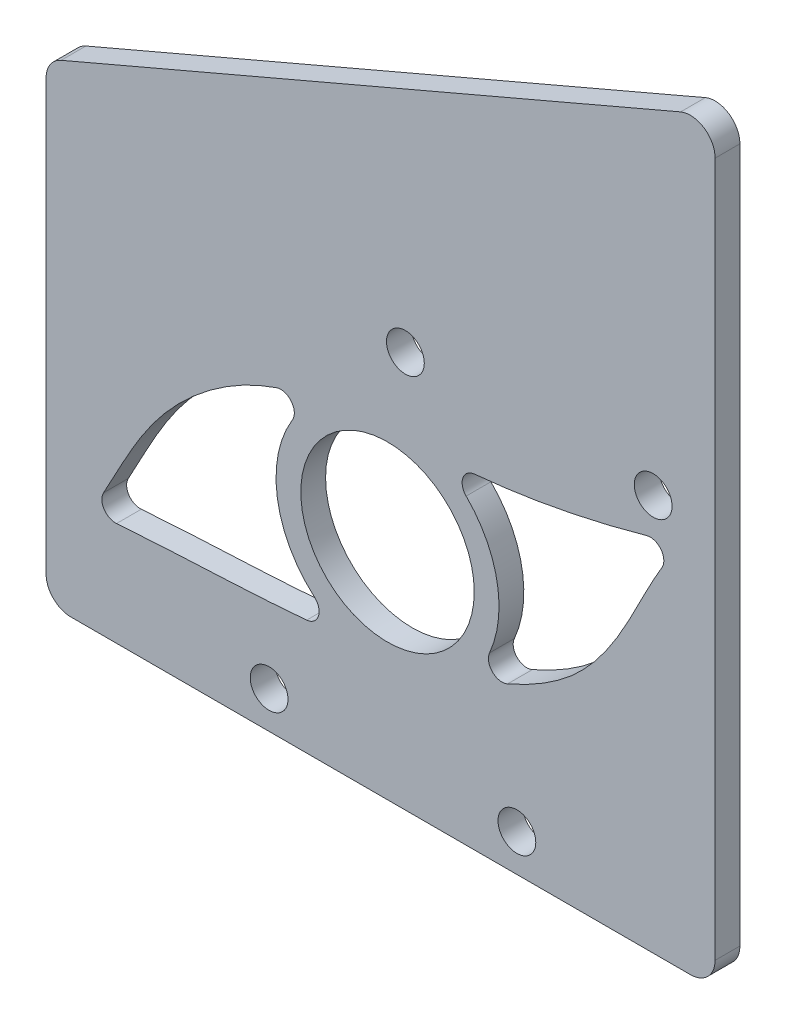
ISO-10303-21;
HEADER;
FILE_DESCRIPTION(('STEP AP214'),'2;1');
FILE_NAME('part.step','',(''),(''),'','','');
FILE_SCHEMA(('AUTOMOTIVE_DESIGN { 1 0 10303 214 1 1 1 1 }'));
ENDSEC;
DATA;
#1=APPLICATION_CONTEXT('core data for automotive mechanical design processes');
#2=APPLICATION_PROTOCOL_DEFINITION('international standard','automotive_design',2000,#1);
#3=PRODUCT_CONTEXT('',#1,'mechanical');
#4=PRODUCT('Part','Part','',(#3));
#5=PRODUCT_RELATED_PRODUCT_CATEGORY('part','',(#4));
#6=PRODUCT_DEFINITION_FORMATION('','',#4);
#7=PRODUCT_DEFINITION_CONTEXT('part definition',#1,'design');
#8=PRODUCT_DEFINITION('design','',#6,#7);
#9=PRODUCT_DEFINITION_SHAPE('','',#8);
#10=(LENGTH_UNIT() NAMED_UNIT(*) SI_UNIT(.MILLI.,.METRE.));
#11=(NAMED_UNIT(*) PLANE_ANGLE_UNIT() SI_UNIT($,.RADIAN.));
#12=(NAMED_UNIT(*) SI_UNIT($,.STERADIAN.) SOLID_ANGLE_UNIT());
#13=UNCERTAINTY_MEASURE_WITH_UNIT(LENGTH_MEASURE(1.E-05),#10,'distance_accuracy_value','');
#14=(GEOMETRIC_REPRESENTATION_CONTEXT(3) GLOBAL_UNCERTAINTY_ASSIGNED_CONTEXT((#13)) GLOBAL_UNIT_ASSIGNED_CONTEXT((#10,
#11,#12)) REPRESENTATION_CONTEXT('',''));
#15=CARTESIAN_POINT('',(0.,0.,0.));
#16=DIRECTION('',(0.,0.,1.));
#17=DIRECTION('',(1.,0.,0.));
#18=AXIS2_PLACEMENT_3D('',#15,#16,#17);
#19=CARTESIAN_POINT('',(24.4834686689324,-6.167126567928,-52.5424006692833));
#20=CARTESIAN_POINT('',(18.8149067201333,-7.97288352978751,-52.5424006692833));
#21=CARTESIAN_POINT('',(9.98146004351233,-9.93232100835814,-52.5424006692833));
#22=CARTESIAN_POINT('',(-1.49904126776518,-10.1027118257672,-52.5424006692833));
#23=CARTESIAN_POINT('',(-10.8339013777596,-11.7565277484964,-52.5424006692833));
#24=CARTESIAN_POINT('',(-18.8414235125109,-18.327485380999,-52.5424006692833));
#25=CARTESIAN_POINT('',(-21.6732340433988,-24.9521936855528,-52.5424006692833));
#26=CARTESIAN_POINT('',(-23.3973415018457,-27.8034822102587,-52.5424006692833));
#27=B_SPLINE_CURVE_WITH_KNOTS('',3,(#19,#20,#21,#22,#23,#24,#25,#26),.UNSPECIFIED.,.F.,.F.,(4,1,
1,1,1,4),(0.,0.320082160262888,0.479359865473657,0.616457885345299,0.821262387023552,1.),.UNSPECIFIED.);
#28=DIRECTION('',(0.,0.,1.));
#29=VECTOR('',#28,1.);
#30=SURFACE_OF_LINEAR_EXTRUSION('',#27,#29);
#31=CARTESIAN_POINT('',(24.4834686689324,-6.167126567928,0.));
#32=CARTESIAN_POINT('',(18.8149067201333,-7.97288352978751,0.));
#33=CARTESIAN_POINT('',(9.98146004351233,-9.93232100835814,0.));
#34=CARTESIAN_POINT('',(-1.49904126776518,-10.1027118257672,0.));
#35=CARTESIAN_POINT('',(-10.8339013777596,-11.7565277484964,0.));
#36=CARTESIAN_POINT('',(-18.8414235125109,-18.327485380999,0.));
#37=CARTESIAN_POINT('',(-21.6732340433988,-24.9521936855528,0.));
#38=CARTESIAN_POINT('',(-23.3973415018457,-27.8034822102587,0.));
#39=B_SPLINE_CURVE_WITH_KNOTS('',3,(#31,#32,#33,#34,#35,#36,#37,#38),.UNSPECIFIED.,.F.,.F.,(4,1,
1,1,1,4),(0.,0.320082160262888,0.479359865473657,0.616457885345299,0.821262387023552,1.),.UNSPECIFIED.);
#40=CARTESIAN_POINT('',(21.4597985438598,-7.07553364279421,0.));
#41=VERTEX_POINT('',#40);
#42=CARTESIAN_POINT('',(7.57735937615618,-9.72232528661631,0.));
#43=VERTEX_POINT('',#42);
#44=EDGE_CURVE('E224',#41,#43,#39,.T.);
#45=ORIENTED_EDGE('',*,*,#44,.F.);
#46=DIRECTION('',(0.,0.,1.));
#47=VECTOR('',#46,1.);
#48=CARTESIAN_POINT('',(21.4597985438598,-7.07553364279422,0.));
#49=LINE('',#48,#47);
#50=CARTESIAN_POINT('',(21.4597985438598,-7.07553364279421,2.));
#51=VERTEX_POINT('',#50);
#52=EDGE_CURVE('E346',#41,#51,#49,.T.);
#53=ORIENTED_EDGE('',*,*,#52,.T.);
#54=CARTESIAN_POINT('',(24.4834686689324,-6.167126567928,2.));
#55=CARTESIAN_POINT('',(18.8149067201333,-7.97288352978751,2.));
#56=CARTESIAN_POINT('',(9.98146004351233,-9.93232100835814,2.));
#57=CARTESIAN_POINT('',(-1.49904126776518,-10.1027118257672,2.));
#58=CARTESIAN_POINT('',(-10.8339013777596,-11.7565277484964,2.));
#59=CARTESIAN_POINT('',(-18.8414235125109,-18.327485380999,2.));
#60=CARTESIAN_POINT('',(-21.6732340433988,-24.9521936855528,2.));
#61=CARTESIAN_POINT('',(-23.3973415018457,-27.8034822102587,2.));
#62=B_SPLINE_CURVE_WITH_KNOTS('',3,(#54,#55,#56,#57,#58,#59,#60,#61),.UNSPECIFIED.,.F.,.F.,(4,1,
1,1,1,4),(0.,0.320082160262888,0.479359865473657,0.616457885345299,0.821262387023552,1.),.UNSPECIFIED.);
#63=CARTESIAN_POINT('',(7.57735937615618,-9.72232528661631,2.));
#64=VERTEX_POINT('',#63);
#65=EDGE_CURVE('E206',#51,#64,#62,.T.);
#66=ORIENTED_EDGE('',*,*,#65,.T.);
#67=DIRECTION('',(0.,0.,1.));
#68=VECTOR('',#67,1.);
#69=CARTESIAN_POINT('',(7.57735937615618,-9.72232528661631,2.));
#70=LINE('',#69,#68);
#71=EDGE_CURVE('E349',#64,#43,#70,.F.);
#72=ORIENTED_EDGE('',*,*,#71,.T.);
#73=EDGE_LOOP('',(#45,#53,#66,#72));
#74=FACE_BOUND('',#73,.T.);
#75=ADVANCED_FACE('F35',(#74),#30,.F.);
#76=CARTESIAN_POINT('',(-23.3973415018457,-27.8034822102587,-52.5424006692833));
#77=CARTESIAN_POINT('',(-13.158468218241,-26.8216783748354,-52.5424006692833));
#78=CARTESIAN_POINT('',(0.767412540322951,-27.6833637015495,-52.5424006692833));
#79=CARTESIAN_POINT('',(15.1765083389906,-20.9102095983924,-52.5424006692833));
#80=CARTESIAN_POINT('',(20.3554938314466,-13.9729246686332,-52.5424006692833));
#81=CARTESIAN_POINT('',(22.1635448027454,-8.91937274897324,-52.5424006692833));
#82=CARTESIAN_POINT('',(24.4834686689324,-6.167126567928,-52.5424006692833));
#83=B_SPLINE_CURVE_WITH_KNOTS('',3,(#76,#77,#78,#79,#80,#81,#82),.UNSPECIFIED.,.F.,.F.,(4,1,1,1,
4),(0.,0.548813093772801,0.719371646716377,0.811056969869215,1.),.UNSPECIFIED.);
#84=DIRECTION('',(0.,0.,1.));
#85=VECTOR('',#84,1.);
#86=SURFACE_OF_LINEAR_EXTRUSION('',#83,#85);
#87=CARTESIAN_POINT('',(-23.3973415018457,-27.8034822102587,2.));
#88=CARTESIAN_POINT('',(-13.158468218241,-26.8216783748354,2.));
#89=CARTESIAN_POINT('',(0.767412540322951,-27.6833637015495,2.));
#90=CARTESIAN_POINT('',(15.1765083389906,-20.9102095983924,2.));
#91=CARTESIAN_POINT('',(20.3554938314466,-13.9729246686332,2.));
#92=CARTESIAN_POINT('',(22.1635448027454,-8.91937274897324,2.));
#93=CARTESIAN_POINT('',(24.4834686689324,-6.167126567928,2.));
#94=B_SPLINE_CURVE_WITH_KNOTS('',3,(#87,#88,#89,#90,#91,#92,#93),.UNSPECIFIED.,.F.,.F.,(4,1,1,1,
4),(0.,0.548813093772801,0.719371646716377,0.811056969869215,1.),.UNSPECIFIED.);
#95=CARTESIAN_POINT('',(-21.316130722331,-27.6251175411089,2.));
#96=VERTEX_POINT('',#95);
#97=CARTESIAN_POINT('',(-5.96758994390592,-26.7017172617705,2.));
#98=VERTEX_POINT('',#97);
#99=EDGE_CURVE('E191',#96,#98,#94,.T.);
#100=ORIENTED_EDGE('',*,*,#99,.T.);
#101=DIRECTION('',(0.,0.,1.));
#102=VECTOR('',#101,1.);
#103=CARTESIAN_POINT('',(-5.96758994390591,-26.7017172617705,2.));
#104=LINE('',#103,#102);
#105=CARTESIAN_POINT('',(-5.96758994390592,-26.7017172617705,0.));
#106=VERTEX_POINT('',#105);
#107=EDGE_CURVE('E195',#98,#106,#104,.F.);
#108=ORIENTED_EDGE('',*,*,#107,.T.);
#109=CARTESIAN_POINT('',(-23.3973415018457,-27.8034822102587,0.));
#110=CARTESIAN_POINT('',(-13.158468218241,-26.8216783748354,0.));
#111=CARTESIAN_POINT('',(0.767412540322951,-27.6833637015495,0.));
#112=CARTESIAN_POINT('',(15.1765083389906,-20.9102095983924,0.));
#113=CARTESIAN_POINT('',(20.3554938314466,-13.9729246686332,0.));
#114=CARTESIAN_POINT('',(22.1635448027454,-8.91937274897324,0.));
#115=CARTESIAN_POINT('',(24.4834686689324,-6.167126567928,0.));
#116=B_SPLINE_CURVE_WITH_KNOTS('',3,(#109,#110,#111,#112,#113,#114,#115),.UNSPECIFIED.,.F.,.F.,
(4,1,1,1,4),(0.,0.548813093772801,0.719371646716377,0.811056969869215,1.),.UNSPECIFIED.);
#117=CARTESIAN_POINT('',(-21.316130722331,-27.6251175411089,0.));
#118=VERTEX_POINT('',#117);
#119=EDGE_CURVE('E194',#118,#106,#116,.T.);
#120=ORIENTED_EDGE('',*,*,#119,.F.);
#121=DIRECTION('',(0.,0.,1.));
#122=VECTOR('',#121,1.);
#123=CARTESIAN_POINT('',(-21.316130722331,-27.6251175411089,0.));
#124=LINE('',#123,#122);
#125=EDGE_CURVE('E177',#118,#96,#124,.T.);
#126=ORIENTED_EDGE('',*,*,#125,.T.);
#127=EDGE_LOOP('',(#100,#108,#120,#126));
#128=FACE_BOUND('',#127,.T.);
#129=ADVANCED_FACE('F189',(#128),#86,.F.);
#130=CARTESIAN_POINT('',(27.,-36.,2.));
#131=DIRECTION('',(-1.,0.,0.));
#132=DIRECTION('',(0.,0.,1.));
#133=AXIS2_PLACEMENT_3D('',#130,#131,#132);
#134=PLANE('',#133);
#135=DIRECTION('',(0.,1.,0.));
#136=VECTOR('',#135,1.);
#137=CARTESIAN_POINT('',(27.,-36.,0.));
#138=LINE('',#137,#136);
#139=CARTESIAN_POINT('',(27.,-34.,0.));
#140=VERTEX_POINT('',#139);
#141=CARTESIAN_POINT('',(27.,22.0742005455741,0.));
#142=VERTEX_POINT('',#141);
#143=EDGE_CURVE('E432',#140,#142,#138,.T.);
#144=ORIENTED_EDGE('',*,*,#143,.T.);
#145=DIRECTION('',(0.,0.,1.));
#146=VECTOR('',#145,1.);
#147=CARTESIAN_POINT('',(27.,22.0742005455741,2.));
#148=LINE('',#147,#146);
#149=CARTESIAN_POINT('',(27.,22.0742005455741,2.));
#150=VERTEX_POINT('',#149);
#151=EDGE_CURVE('E415',#142,#150,#148,.T.);
#152=ORIENTED_EDGE('',*,*,#151,.T.);
#153=DIRECTION('',(0.,1.,0.));
#154=VECTOR('',#153,1.);
#155=CARTESIAN_POINT('',(27.,-36.,2.));
#156=LINE('',#155,#154);
#157=CARTESIAN_POINT('',(27.,-34.,2.));
#158=VERTEX_POINT('',#157);
#159=EDGE_CURVE('E434',#158,#150,#156,.T.);
#160=ORIENTED_EDGE('',*,*,#159,.F.);
#161=DIRECTION('',(0.,0.,-1.));
#162=VECTOR('',#161,1.);
#163=CARTESIAN_POINT('',(27.,-34.,2.));
#164=LINE('',#163,#162);
#165=EDGE_CURVE('E412',#158,#140,#164,.T.);
#166=ORIENTED_EDGE('',*,*,#165,.T.);
#167=EDGE_LOOP('',(#144,#152,#160,#166));
#168=FACE_BOUND('',#167,.T.);
#169=ADVANCED_FACE('F294',(#168),#134,.F.);
#170=CARTESIAN_POINT('',(-27.,-36.,2.));
#171=DIRECTION('',(1.,0.,0.));
#172=DIRECTION('',(0.,0.,-1.));
#173=AXIS2_PLACEMENT_3D('',#170,#171,#172);
#174=PLANE('',#173);
#175=DIRECTION('',(0.,-1.,0.));
#176=VECTOR('',#175,1.);
#177=CARTESIAN_POINT('',(-27.,-36.,2.));
#178=LINE('',#177,#176);
#179=CARTESIAN_POINT('',(-27.,0.68036519451798,2.));
#180=VERTEX_POINT('',#179);
#181=CARTESIAN_POINT('',(-27.,-34.,2.));
#182=VERTEX_POINT('',#181);
#183=EDGE_CURVE('E428',#180,#182,#178,.T.);
#184=ORIENTED_EDGE('',*,*,#183,.F.);
#185=DIRECTION('',(0.,0.,1.));
#186=VECTOR('',#185,1.);
#187=CARTESIAN_POINT('',(-27.,0.68036519451798,2.));
#188=LINE('',#187,#186);
#189=CARTESIAN_POINT('',(-27.,0.68036519451798,0.));
#190=VERTEX_POINT('',#189);
#191=EDGE_CURVE('E404',#180,#190,#188,.F.);
#192=ORIENTED_EDGE('',*,*,#191,.T.);
#193=DIRECTION('',(0.,-1.,0.));
#194=VECTOR('',#193,1.);
#195=CARTESIAN_POINT('',(-27.,-36.,0.));
#196=LINE('',#195,#194);
#197=CARTESIAN_POINT('',(-27.,-34.,0.));
#198=VERTEX_POINT('',#197);
#199=EDGE_CURVE('E439',#190,#198,#196,.T.);
#200=ORIENTED_EDGE('',*,*,#199,.T.);
#201=DIRECTION('',(0.,0.,-1.));
#202=VECTOR('',#201,1.);
#203=CARTESIAN_POINT('',(-27.,-34.,2.));
#204=LINE('',#203,#202);
#205=EDGE_CURVE('E402',#198,#182,#204,.F.);
#206=ORIENTED_EDGE('',*,*,#205,.T.);
#207=EDGE_LOOP('',(#184,#192,#200,#206));
#208=FACE_BOUND('',#207,.T.);
#209=ADVANCED_FACE('F290',(#208),#174,.F.);
#210=CARTESIAN_POINT('',(-27.,-36.,2.));
#211=DIRECTION('',(0.,1.,0.));
#212=DIRECTION('',(0.,0.,1.));
#213=AXIS2_PLACEMENT_3D('',#210,#211,#212);
#214=PLANE('',#213);
#215=DIRECTION('',(1.,0.,0.));
#216=VECTOR('',#215,1.);
#217=CARTESIAN_POINT('',(-27.,-36.,2.));
#218=LINE('',#217,#216);
#219=CARTESIAN_POINT('',(-25.,-36.,2.));
#220=VERTEX_POINT('',#219);
#221=CARTESIAN_POINT('',(25.,-36.,2.));
#222=VERTEX_POINT('',#221);
#223=EDGE_CURVE('E196',#220,#222,#218,.T.);
#224=ORIENTED_EDGE('',*,*,#223,.F.);
#225=DIRECTION('',(0.,0.,-1.));
#226=VECTOR('',#225,1.);
#227=CARTESIAN_POINT('',(-25.,-36.,2.));
#228=LINE('',#227,#226);
#229=CARTESIAN_POINT('',(-25.,-36.,0.));
#230=VERTEX_POINT('',#229);
#231=EDGE_CURVE('E11',#220,#230,#228,.T.);
#232=ORIENTED_EDGE('',*,*,#231,.T.);
#233=DIRECTION('',(1.,0.,0.));
#234=VECTOR('',#233,1.);
#235=CARTESIAN_POINT('',(-27.,-36.,0.));
#236=LINE('',#235,#234);
#237=CARTESIAN_POINT('',(25.,-36.,0.));
#238=VERTEX_POINT('',#237);
#239=EDGE_CURVE('E420',#230,#238,#236,.T.);
#240=ORIENTED_EDGE('',*,*,#239,.T.);
#241=DIRECTION('',(0.,0.,-1.));
#242=VECTOR('',#241,1.);
#243=CARTESIAN_POINT('',(25.,-36.,2.));
#244=LINE('',#243,#242);
#245=EDGE_CURVE('E43',#238,#222,#244,.F.);
#246=ORIENTED_EDGE('',*,*,#245,.T.);
#247=EDGE_LOOP('',(#224,#232,#240,#246));
#248=FACE_BOUND('',#247,.T.);
#249=ADVANCED_FACE('F283',(#248),#214,.F.);
#250=CARTESIAN_POINT('',(0.,0.,2.));
#251=DIRECTION('',(0.,0.,-1.));
#252=DIRECTION('',(-1.,0.,0.));
#253=AXIS2_PLACEMENT_3D('',#250,#251,#252);
#254=PLANE('',#253);
#255=CARTESIAN_POINT('',(10.2432747561689,-23.0587249000968,2.));
#256=VERTEX_POINT('',#255);
#257=CARTESIAN_POINT('',(22.7017523320478,-8.70002765039837,2.));
#258=VERTEX_POINT('',#257);
#259=EDGE_CURVE('E204',#256,#258,#94,.T.);
#260=ORIENTED_EDGE('',*,*,#259,.F.);
#261=CARTESIAN_POINT('',(9.80157844743188,-22.0513002771854,2.));
#262=DIRECTION('',(0.,0.,-1.));
#263=DIRECTION('',(-1.,0.,0.));
#264=AXIS2_PLACEMENT_3D('',#261,#262,#263);
#265=CIRCLE('',#264,1.1);
#266=CARTESIAN_POINT('',(8.79486911469692,-21.6079761075484,2.));
#267=VERTEX_POINT('',#266);
#268=EDGE_CURVE('E377',#256,#267,#265,.T.);
#269=ORIENTED_EDGE('',*,*,#268,.T.);
#270=CARTESIAN_POINT('',(0.558156392319958,-17.980778355973,2.));
#271=DIRECTION('',(0.,0.,1.));
#272=DIRECTION('',(1.,0.,0.));
#273=AXIS2_PLACEMENT_3D('',#270,#271,#272);
#274=CIRCLE('',#273,9.);
#275=CARTESIAN_POINT('',(6.90304701555683,-11.597803894238,2.));
#276=VERTEX_POINT('',#275);
#277=EDGE_CURVE('E473',#267,#276,#274,.T.);
#278=ORIENTED_EDGE('',*,*,#277,.T.);
#279=CARTESIAN_POINT('',(7.67853364728578,-10.8176625711371,2.));
#280=DIRECTION('',(0.,0.,-1.));
#281=DIRECTION('',(-1.,0.,0.));
#282=AXIS2_PLACEMENT_3D('',#279,#280,#281);
#283=CIRCLE('',#282,1.1);
#284=EDGE_CURVE('E184',#276,#64,#283,.T.);
#285=ORIENTED_EDGE('',*,*,#284,.T.);
#286=ORIENTED_EDGE('',*,*,#65,.F.);
#287=CARTESIAN_POINT('',(21.7584261783473,-8.13422223530874,2.));
#288=DIRECTION('',(0.,0.,-1.));
#289=DIRECTION('',(-1.,0.,0.));
#290=AXIS2_PLACEMENT_3D('',#287,#288,#289);
#291=CIRCLE('',#290,1.1);
#292=EDGE_CURVE('E353',#51,#258,#291,.T.);
#293=ORIENTED_EDGE('',*,*,#292,.T.);
#294=EDGE_LOOP('',(#260,#269,#278,#285,#286,#293));
#295=FACE_BOUND('',#294,.T.);
#296=CARTESIAN_POINT('',(-8.42250091878612,-11.6817790482168,2.));
#297=VERTEX_POINT('',#296);
#298=CARTESIAN_POINT('',(-22.3644937882554,-25.9995137748564,2.));
#299=VERTEX_POINT('',#298);
#300=EDGE_CURVE('E203',#297,#299,#62,.T.);
#301=ORIENTED_EDGE('',*,*,#300,.F.);
#302=CARTESIAN_POINT('',(-8.06478714875739,-12.7219909779369,2.));
#303=DIRECTION('',(0.,0.,-1.));
#304=DIRECTION('',(-1.,0.,0.));
#305=AXIS2_PLACEMENT_3D('',#302,#303,#304);
#306=CIRCLE('',#305,1.1);
#307=CARTESIAN_POINT('',(-7.12565468388758,-13.2947301973269,2.));
#308=VERTEX_POINT('',#307);
#309=EDGE_CURVE('E385',#297,#308,#306,.T.);
#310=ORIENTED_EDGE('',*,*,#309,.T.);
#311=CARTESIAN_POINT('',(-5.34361746633097,-24.7755605689173,2.));
#312=VERTEX_POINT('',#311);
#313=EDGE_CURVE('E469',#308,#312,#274,.T.);
#314=ORIENTED_EDGE('',*,*,#313,.T.);
#315=CARTESIAN_POINT('',(-6.0649453823883,-25.6060339504994,2.));
#316=DIRECTION('',(0.,0.,-1.));
#317=DIRECTION('',(-1.,0.,0.));
#318=AXIS2_PLACEMENT_3D('',#315,#316,#317);
#319=CIRCLE('',#318,1.1);
#320=EDGE_CURVE('E202',#312,#98,#319,.T.);
#321=ORIENTED_EDGE('',*,*,#320,.T.);
#322=ORIENTED_EDGE('',*,*,#99,.F.);
#323=CARTESIAN_POINT('',(-21.3999371076979,-26.528314692019,2.));
#324=DIRECTION('',(0.,0.,-1.));
#325=DIRECTION('',(-1.,0.,0.));
#326=AXIS2_PLACEMENT_3D('',#323,#324,#325);
#327=CIRCLE('',#326,1.1);
#328=EDGE_CURVE('E173',#96,#299,#327,.T.);
#329=ORIENTED_EDGE('',*,*,#328,.T.);
#330=EDGE_LOOP('',(#301,#310,#314,#321,#322,#329));
#331=FACE_BOUND('',#330,.T.);
#332=CARTESIAN_POINT('',(-8.99999999999999,-33.,2.));
#333=DIRECTION('',(0.,0.,1.));
#334=DIRECTION('',(1.,0.,0.));
#335=AXIS2_PLACEMENT_3D('',#332,#333,#334);
#336=CIRCLE('',#335,1.525);
#337=CARTESIAN_POINT('',(-7.47499999999999,-33.,2.));
#338=VERTEX_POINT('',#337);
#339=EDGE_CURVE('E453',#338,#338,#336,.T.);
#340=ORIENTED_EDGE('',*,*,#339,.F.);
#341=EDGE_LOOP('',(#340));
#342=FACE_BOUND('',#341,.T.);
#343=CARTESIAN_POINT('',(11.,-33.,2.));
#344=DIRECTION('',(0.,0.,1.));
#345=DIRECTION('',(1.,0.,0.));
#346=AXIS2_PLACEMENT_3D('',#343,#344,#345);
#347=CIRCLE('',#346,1.525);
#348=CARTESIAN_POINT('',(12.525,-33.,2.));
#349=VERTEX_POINT('',#348);
#350=EDGE_CURVE('E484',#349,#349,#347,.T.);
#351=ORIENTED_EDGE('',*,*,#350,.F.);
#352=EDGE_LOOP('',(#351));
#353=FACE_BOUND('',#352,.T.);
#354=CARTESIAN_POINT('',(1.99999999999999,-4.00000000000002,2.));
#355=DIRECTION('',(0.,0.,1.));
#356=DIRECTION('',(1.,0.,0.));
#357=AXIS2_PLACEMENT_3D('',#354,#355,#356);
#358=CIRCLE('',#357,1.525);
#359=CARTESIAN_POINT('',(3.525,-4.00000000000002,2.));
#360=VERTEX_POINT('',#359);
#361=EDGE_CURVE('E479',#360,#360,#358,.T.);
#362=ORIENTED_EDGE('',*,*,#361,.F.);
#363=EDGE_LOOP('',(#362));
#364=FACE_BOUND('',#363,.T.);
#365=CARTESIAN_POINT('',(22.,-4.00000000000002,2.));
#366=DIRECTION('',(0.,0.,1.));
#367=DIRECTION('',(1.,0.,0.));
#368=AXIS2_PLACEMENT_3D('',#365,#366,#367);
#369=CIRCLE('',#368,1.525);
#370=CARTESIAN_POINT('',(23.525,-4.00000000000002,2.));
#371=VERTEX_POINT('',#370);
#372=EDGE_CURVE('E477',#371,#371,#369,.T.);
#373=ORIENTED_EDGE('',*,*,#372,.F.);
#374=EDGE_LOOP('',(#373));
#375=FACE_BOUND('',#374,.T.);
#376=DIRECTION('',(0.919376128844431,0.393379630523783,0.));
#377=VECTOR('',#376,1.);
#378=CARTESIAN_POINT('',(-27.,2.,2.));
#379=LINE('',#378,#377);
#380=CARTESIAN_POINT('',(-25.7867592610476,2.51911745220684,2.));
#381=VERTEX_POINT('',#380);
#382=CARTESIAN_POINT('',(24.2132407389524,23.912952803263,2.));
#383=VERTEX_POINT('',#382);
#384=EDGE_CURVE('E444',#381,#383,#379,.T.);
#385=ORIENTED_EDGE('',*,*,#384,.F.);
#386=CARTESIAN_POINT('',(-25.,0.680365194517981,2.));
#387=DIRECTION('',(0.,0.,-1.));
#388=DIRECTION('',(-1.,0.,0.));
#389=AXIS2_PLACEMENT_3D('',#386,#387,#388);
#390=CIRCLE('',#389,2.);
#391=EDGE_CURVE('E400',#381,#180,#390,.F.);
#392=ORIENTED_EDGE('',*,*,#391,.T.);
#393=ORIENTED_EDGE('',*,*,#183,.T.);
#394=CARTESIAN_POINT('',(-25.,-34.,2.));
#395=DIRECTION('',(0.,0.,-1.));
#396=DIRECTION('',(-1.,0.,0.));
#397=AXIS2_PLACEMENT_3D('',#394,#395,#396);
#398=CIRCLE('',#397,2.);
#399=EDGE_CURVE('E396',#182,#220,#398,.F.);
#400=ORIENTED_EDGE('',*,*,#399,.T.);
#401=ORIENTED_EDGE('',*,*,#223,.T.);
#402=CARTESIAN_POINT('',(25.,-34.,2.));
#403=DIRECTION('',(0.,0.,-1.));
#404=DIRECTION('',(-1.,0.,0.));
#405=AXIS2_PLACEMENT_3D('',#402,#403,#404);
#406=CIRCLE('',#405,2.);
#407=EDGE_CURVE('E394',#222,#158,#406,.F.);
#408=ORIENTED_EDGE('',*,*,#407,.T.);
#409=ORIENTED_EDGE('',*,*,#159,.T.);
#410=CARTESIAN_POINT('',(25.,22.0742005455741,2.));
#411=DIRECTION('',(0.,0.,-1.));
#412=DIRECTION('',(-1.,0.,0.));
#413=AXIS2_PLACEMENT_3D('',#410,#411,#412);
#414=CIRCLE('',#413,2.);
#415=EDGE_CURVE('E398',#150,#383,#414,.F.);
#416=ORIENTED_EDGE('',*,*,#415,.T.);
#417=EDGE_LOOP('',(#385,#392,#393,#400,#401,#408,#409,#416));
#418=FACE_BOUND('',#417,.T.);
#419=CARTESIAN_POINT('',(0.558156392319958,-17.980778355973,2.));
#420=DIRECTION('',(0.,0.,1.));
#421=DIRECTION('',(1.,0.,0.));
#422=AXIS2_PLACEMENT_3D('',#419,#420,#421);
#423=CIRCLE('',#422,7.);
#424=CARTESIAN_POINT('',(7.55815639231996,-17.980778355973,2.));
#425=VERTEX_POINT('',#424);
#426=EDGE_CURVE('E513',#425,#425,#423,.T.);
#427=ORIENTED_EDGE('',*,*,#426,.F.);
#428=EDGE_LOOP('',(#427));
#429=FACE_BOUND('',#428,.T.);
#430=ADVANCED_FACE('F198',(#295,#331,#342,#353,#364,#375,#418,#429),#254,.F.);
#431=CARTESIAN_POINT('',(0.,0.,0.));
#432=DIRECTION('',(0.,0.,-1.));
#433=DIRECTION('',(-1.,0.,0.));
#434=AXIS2_PLACEMENT_3D('',#431,#432,#433);
#435=PLANE('',#434);
#436=CARTESIAN_POINT('',(10.2432747561689,-23.0587249000968,0.));
#437=VERTEX_POINT('',#436);
#438=CARTESIAN_POINT('',(22.7017523320478,-8.70002765039837,0.));
#439=VERTEX_POINT('',#438);
#440=EDGE_CURVE('E225',#437,#439,#116,.T.);
#441=ORIENTED_EDGE('',*,*,#440,.T.);
#442=CARTESIAN_POINT('',(21.7584261783473,-8.13422223530874,0.));
#443=DIRECTION('',(0.,0.,-1.));
#444=DIRECTION('',(-1.,0.,0.));
#445=AXIS2_PLACEMENT_3D('',#442,#443,#444);
#446=CIRCLE('',#445,1.1);
#447=EDGE_CURVE('E352',#439,#41,#446,.F.);
#448=ORIENTED_EDGE('',*,*,#447,.T.);
#449=ORIENTED_EDGE('',*,*,#44,.T.);
#450=CARTESIAN_POINT('',(7.67853364728578,-10.8176625711371,0.));
#451=DIRECTION('',(0.,0.,-1.));
#452=DIRECTION('',(-1.,0.,0.));
#453=AXIS2_PLACEMENT_3D('',#450,#451,#452);
#454=CIRCLE('',#453,1.1);
#455=CARTESIAN_POINT('',(6.90304701555683,-11.597803894238,0.));
#456=VERTEX_POINT('',#455);
#457=EDGE_CURVE('E381',#43,#456,#454,.F.);
#458=ORIENTED_EDGE('',*,*,#457,.T.);
#459=CARTESIAN_POINT('',(0.558156392319958,-17.980778355973,0.));
#460=DIRECTION('',(0.,0.,-1.));
#461=DIRECTION('',(-1.,0.,0.));
#462=AXIS2_PLACEMENT_3D('',#459,#460,#461);
#463=CIRCLE('',#462,9.);
#464=CARTESIAN_POINT('',(8.79486911469692,-21.6079761075484,0.));
#465=VERTEX_POINT('',#464);
#466=EDGE_CURVE('E510',#465,#456,#463,.F.);
#467=ORIENTED_EDGE('',*,*,#466,.F.);
#468=CARTESIAN_POINT('',(9.80157844743188,-22.0513002771854,0.));
#469=DIRECTION('',(0.,0.,-1.));
#470=DIRECTION('',(-1.,0.,0.));
#471=AXIS2_PLACEMENT_3D('',#468,#469,#470);
#472=CIRCLE('',#471,1.1);
#473=EDGE_CURVE('E379',#465,#437,#472,.F.);
#474=ORIENTED_EDGE('',*,*,#473,.T.);
#475=EDGE_LOOP('',(#441,#448,#449,#458,#467,#474));
#476=FACE_BOUND('',#475,.T.);
#477=CARTESIAN_POINT('',(-7.12565468388758,-13.2947301973269,0.));
#478=VERTEX_POINT('',#477);
#479=CARTESIAN_POINT('',(-5.34361746633097,-24.7755605689173,0.));
#480=VERTEX_POINT('',#479);
#481=EDGE_CURVE('E472',#478,#480,#463,.F.);
#482=ORIENTED_EDGE('',*,*,#481,.F.);
#483=CARTESIAN_POINT('',(-8.06478714875739,-12.7219909779369,0.));
#484=DIRECTION('',(0.,0.,-1.));
#485=DIRECTION('',(-1.,0.,0.));
#486=AXIS2_PLACEMENT_3D('',#483,#484,#485);
#487=CIRCLE('',#486,1.1);
#488=CARTESIAN_POINT('',(-8.42250091878612,-11.6817790482168,0.));
#489=VERTEX_POINT('',#488);
#490=EDGE_CURVE('E387',#478,#489,#487,.F.);
#491=ORIENTED_EDGE('',*,*,#490,.T.);
#492=CARTESIAN_POINT('',(-22.3644937882554,-25.9995137748564,0.));
#493=VERTEX_POINT('',#492);
#494=EDGE_CURVE('E216',#489,#493,#39,.T.);
#495=ORIENTED_EDGE('',*,*,#494,.T.);
#496=CARTESIAN_POINT('',(-21.3999371076979,-26.528314692019,0.));
#497=DIRECTION('',(0.,0.,-1.));
#498=DIRECTION('',(-1.,0.,0.));
#499=AXIS2_PLACEMENT_3D('',#496,#497,#498);
#500=CIRCLE('',#499,1.1);
#501=EDGE_CURVE('E183',#493,#118,#500,.F.);
#502=ORIENTED_EDGE('',*,*,#501,.T.);
#503=ORIENTED_EDGE('',*,*,#119,.T.);
#504=CARTESIAN_POINT('',(-6.0649453823883,-25.6060339504994,0.));
#505=DIRECTION('',(0.,0.,-1.));
#506=DIRECTION('',(-1.,0.,0.));
#507=AXIS2_PLACEMENT_3D('',#504,#505,#506);
#508=CIRCLE('',#507,1.1);
#509=EDGE_CURVE('E372',#106,#480,#508,.F.);
#510=ORIENTED_EDGE('',*,*,#509,.T.);
#511=EDGE_LOOP('',(#482,#491,#495,#502,#503,#510));
#512=FACE_BOUND('',#511,.T.);
#513=CARTESIAN_POINT('',(-8.99999999999999,-33.,0.));
#514=DIRECTION('',(0.,0.,-1.));
#515=DIRECTION('',(-1.,0.,0.));
#516=AXIS2_PLACEMENT_3D('',#513,#514,#515);
#517=CIRCLE('',#516,1.525);
#518=CARTESIAN_POINT('',(-10.525,-33.,0.));
#519=VERTEX_POINT('',#518);
#520=EDGE_CURVE('E459',#519,#519,#517,.T.);
#521=ORIENTED_EDGE('',*,*,#520,.F.);
#522=EDGE_LOOP('',(#521));
#523=FACE_BOUND('',#522,.T.);
#524=CARTESIAN_POINT('',(11.,-33.,0.));
#525=DIRECTION('',(0.,0.,-1.));
#526=DIRECTION('',(-1.,0.,0.));
#527=AXIS2_PLACEMENT_3D('',#524,#525,#526);
#528=CIRCLE('',#527,1.525);
#529=CARTESIAN_POINT('',(9.47500000000001,-33.,0.));
#530=VERTEX_POINT('',#529);
#531=EDGE_CURVE('E456',#530,#530,#528,.T.);
#532=ORIENTED_EDGE('',*,*,#531,.F.);
#533=EDGE_LOOP('',(#532));
#534=FACE_BOUND('',#533,.T.);
#535=CARTESIAN_POINT('',(1.99999999999999,-4.00000000000002,0.));
#536=DIRECTION('',(0.,0.,-1.));
#537=DIRECTION('',(-1.,0.,0.));
#538=AXIS2_PLACEMENT_3D('',#535,#536,#537);
#539=CIRCLE('',#538,1.525);
#540=CARTESIAN_POINT('',(0.474999999999995,-4.00000000000002,0.));
#541=VERTEX_POINT('',#540);
#542=EDGE_CURVE('E452',#541,#541,#539,.T.);
#543=ORIENTED_EDGE('',*,*,#542,.F.);
#544=EDGE_LOOP('',(#543));
#545=FACE_BOUND('',#544,.T.);
#546=CARTESIAN_POINT('',(22.,-4.00000000000002,0.));
#547=DIRECTION('',(0.,0.,-1.));
#548=DIRECTION('',(-1.,0.,0.));
#549=AXIS2_PLACEMENT_3D('',#546,#547,#548);
#550=CIRCLE('',#549,1.525);
#551=CARTESIAN_POINT('',(20.475,-4.00000000000002,0.));
#552=VERTEX_POINT('',#551);
#553=EDGE_CURVE('E449',#552,#552,#550,.T.);
#554=ORIENTED_EDGE('',*,*,#553,.F.);
#555=EDGE_LOOP('',(#554));
#556=FACE_BOUND('',#555,.T.);
#557=ORIENTED_EDGE('',*,*,#199,.F.);
#558=CARTESIAN_POINT('',(-25.,0.680365194517981,0.));
#559=DIRECTION('',(0.,0.,-1.));
#560=DIRECTION('',(-1.,0.,0.));
#561=AXIS2_PLACEMENT_3D('',#558,#559,#560);
#562=CIRCLE('',#561,2.);
#563=CARTESIAN_POINT('',(-25.7867592610476,2.51911745220684,0.));
#564=VERTEX_POINT('',#563);
#565=EDGE_CURVE('E410',#190,#564,#562,.T.);
#566=ORIENTED_EDGE('',*,*,#565,.T.);
#567=DIRECTION('',(0.919376128844431,0.393379630523783,0.));
#568=VECTOR('',#567,1.);
#569=CARTESIAN_POINT('',(-27.,2.,0.));
#570=LINE('',#569,#568);
#571=CARTESIAN_POINT('',(24.2132407389524,23.912952803263,0.));
#572=VERTEX_POINT('',#571);
#573=EDGE_CURVE('E440',#564,#572,#570,.T.);
#574=ORIENTED_EDGE('',*,*,#573,.T.);
#575=CARTESIAN_POINT('',(25.,22.0742005455741,0.));
#576=DIRECTION('',(0.,0.,-1.));
#577=DIRECTION('',(-1.,0.,0.));
#578=AXIS2_PLACEMENT_3D('',#575,#576,#577);
#579=CIRCLE('',#578,2.);
#580=EDGE_CURVE('E408',#572,#142,#579,.T.);
#581=ORIENTED_EDGE('',*,*,#580,.T.);
#582=ORIENTED_EDGE('',*,*,#143,.F.);
#583=CARTESIAN_POINT('',(25.,-34.,0.));
#584=DIRECTION('',(0.,0.,-1.));
#585=DIRECTION('',(-1.,0.,0.));
#586=AXIS2_PLACEMENT_3D('',#583,#584,#585);
#587=CIRCLE('',#586,2.);
#588=EDGE_CURVE('E50',#140,#238,#587,.T.);
#589=ORIENTED_EDGE('',*,*,#588,.T.);
#590=ORIENTED_EDGE('',*,*,#239,.F.);
#591=CARTESIAN_POINT('',(-25.,-34.,0.));
#592=DIRECTION('',(0.,0.,-1.));
#593=DIRECTION('',(-1.,0.,0.));
#594=AXIS2_PLACEMENT_3D('',#591,#592,#593);
#595=CIRCLE('',#594,2.);
#596=EDGE_CURVE('E58',#230,#198,#595,.T.);
#597=ORIENTED_EDGE('',*,*,#596,.T.);
#598=EDGE_LOOP('',(#557,#566,#574,#581,#582,#589,#590,#597));
#599=FACE_BOUND('',#598,.T.);
#600=CARTESIAN_POINT('',(0.558156392319958,-17.980778355973,0.));
#601=DIRECTION('',(0.,0.,-1.));
#602=DIRECTION('',(-1.,0.,0.));
#603=AXIS2_PLACEMENT_3D('',#600,#601,#602);
#604=CIRCLE('',#603,7.);
#605=CARTESIAN_POINT('',(-6.44184360768004,-17.980778355973,0.));
#606=VERTEX_POINT('',#605);
#607=EDGE_CURVE('E209',#606,#606,#604,.F.);
#608=ORIENTED_EDGE('',*,*,#607,.T.);
#609=EDGE_LOOP('',(#608));
#610=FACE_BOUND('',#609,.T.);
#611=ADVANCED_FACE('F279',(#476,#512,#523,#534,#545,#556,#599,#610),#435,.T.);
#612=CARTESIAN_POINT('',(-27.,2.,0.));
#613=DIRECTION('',(0.393379630523783,-0.919376128844431,0.));
#614=DIRECTION('',(0.919376128844431,0.393379630523783,0.));
#615=AXIS2_PLACEMENT_3D('',#612,#613,#614);
#616=PLANE('',#615);
#617=ORIENTED_EDGE('',*,*,#573,.F.);
#618=DIRECTION('',(0.,0.,1.));
#619=VECTOR('',#618,1.);
#620=CARTESIAN_POINT('',(-25.7867592610476,2.51911745220684,0.));
#621=LINE('',#620,#619);
#622=EDGE_CURVE('E391',#564,#381,#621,.T.);
#623=ORIENTED_EDGE('',*,*,#622,.T.);
#624=ORIENTED_EDGE('',*,*,#384,.T.);
#625=DIRECTION('',(0.,0.,1.));
#626=VECTOR('',#625,1.);
#627=CARTESIAN_POINT('',(24.2132407389524,23.912952803263,0.));
#628=LINE('',#627,#626);
#629=EDGE_CURVE('E389',#383,#572,#628,.F.);
#630=ORIENTED_EDGE('',*,*,#629,.T.);
#631=EDGE_LOOP('',(#617,#623,#624,#630));
#632=FACE_BOUND('',#631,.T.);
#633=ADVANCED_FACE('F275',(#632),#616,.F.);
#634=CARTESIAN_POINT('',(22.,-4.00000000000002,-8.));
#635=DIRECTION('',(0.,0.,1.));
#636=DIRECTION('',(1.,0.,0.));
#637=AXIS2_PLACEMENT_3D('',#634,#635,#636);
#638=CYLINDRICAL_SURFACE('',#637,1.525);
#639=ORIENTED_EDGE('',*,*,#553,.T.);
#640=EDGE_LOOP('',(#639));
#641=FACE_BOUND('',#640,.T.);
#642=ORIENTED_EDGE('',*,*,#372,.T.);
#643=EDGE_LOOP('',(#642));
#644=FACE_BOUND('',#643,.T.);
#645=ADVANCED_FACE('F271',(#641,#644),#638,.F.);
#646=CARTESIAN_POINT('',(1.99999999999999,-4.00000000000002,-8.));
#647=DIRECTION('',(0.,0.,1.));
#648=DIRECTION('',(1.,0.,0.));
#649=AXIS2_PLACEMENT_3D('',#646,#647,#648);
#650=CYLINDRICAL_SURFACE('',#649,1.525);
#651=ORIENTED_EDGE('',*,*,#542,.T.);
#652=EDGE_LOOP('',(#651));
#653=FACE_BOUND('',#652,.T.);
#654=ORIENTED_EDGE('',*,*,#361,.T.);
#655=EDGE_LOOP('',(#654));
#656=FACE_BOUND('',#655,.T.);
#657=ADVANCED_FACE('F267',(#653,#656),#650,.F.);
#658=CARTESIAN_POINT('',(11.,-33.,-8.));
#659=DIRECTION('',(0.,0.,1.));
#660=DIRECTION('',(1.,0.,0.));
#661=AXIS2_PLACEMENT_3D('',#658,#659,#660);
#662=CYLINDRICAL_SURFACE('',#661,1.525);
#663=ORIENTED_EDGE('',*,*,#531,.T.);
#664=EDGE_LOOP('',(#663));
#665=FACE_BOUND('',#664,.T.);
#666=ORIENTED_EDGE('',*,*,#350,.T.);
#667=EDGE_LOOP('',(#666));
#668=FACE_BOUND('',#667,.T.);
#669=ADVANCED_FACE('F263',(#665,#668),#662,.F.);
#670=CARTESIAN_POINT('',(-8.99999999999999,-33.,-8.));
#671=DIRECTION('',(0.,0.,1.));
#672=DIRECTION('',(1.,0.,0.));
#673=AXIS2_PLACEMENT_3D('',#670,#671,#672);
#674=CYLINDRICAL_SURFACE('',#673,1.525);
#675=ORIENTED_EDGE('',*,*,#520,.T.);
#676=EDGE_LOOP('',(#675));
#677=FACE_BOUND('',#676,.T.);
#678=ORIENTED_EDGE('',*,*,#339,.T.);
#679=EDGE_LOOP('',(#678));
#680=FACE_BOUND('',#679,.T.);
#681=ADVANCED_FACE('F259',(#677,#680),#674,.F.);
#682=ORIENTED_EDGE('',*,*,#300,.T.);
#683=DIRECTION('',(0.,0.,1.));
#684=VECTOR('',#683,1.);
#685=CARTESIAN_POINT('',(-22.3644937882554,-25.9995137748564,2.));
#686=LINE('',#685,#684);
#687=EDGE_CURVE('E178',#299,#493,#686,.F.);
#688=ORIENTED_EDGE('',*,*,#687,.T.);
#689=ORIENTED_EDGE('',*,*,#494,.F.);
#690=DIRECTION('',(0.,0.,1.));
#691=VECTOR('',#690,1.);
#692=CARTESIAN_POINT('',(-8.42250091878612,-11.6817790482168,0.));
#693=LINE('',#692,#691);
#694=EDGE_CURVE('E368',#489,#297,#693,.T.);
#695=ORIENTED_EDGE('',*,*,#694,.T.);
#696=EDGE_LOOP('',(#682,#688,#689,#695));
#697=FACE_BOUND('',#696,.T.);
#698=ADVANCED_FACE('F253',(#697),#30,.F.);
#699=ORIENTED_EDGE('',*,*,#259,.T.);
#700=DIRECTION('',(0.,0.,1.));
#701=VECTOR('',#700,1.);
#702=CARTESIAN_POINT('',(22.7017523320478,-8.70002765039836,2.));
#703=LINE('',#702,#701);
#704=EDGE_CURVE('E357',#258,#439,#703,.F.);
#705=ORIENTED_EDGE('',*,*,#704,.T.);
#706=ORIENTED_EDGE('',*,*,#440,.F.);
#707=DIRECTION('',(0.,0.,1.));
#708=VECTOR('',#707,1.);
#709=CARTESIAN_POINT('',(10.2432747561689,-23.0587249000968,0.));
#710=LINE('',#709,#708);
#711=EDGE_CURVE('E354',#437,#256,#710,.T.);
#712=ORIENTED_EDGE('',*,*,#711,.T.);
#713=EDGE_LOOP('',(#699,#705,#706,#712));
#714=FACE_BOUND('',#713,.T.);
#715=ADVANCED_FACE('F248',(#714),#86,.F.);
#716=CARTESIAN_POINT('',(0.558156392319958,-17.980778355973,-25.4558441227157));
#717=DIRECTION('',(0.,0.,1.));
#718=DIRECTION('',(1.,0.,0.));
#719=AXIS2_PLACEMENT_3D('',#716,#717,#718);
#720=CYLINDRICAL_SURFACE('',#719,9.);
#721=ORIENTED_EDGE('',*,*,#277,.F.);
#722=DIRECTION('',(0.,0.,1.));
#723=VECTOR('',#722,1.);
#724=CARTESIAN_POINT('',(8.79486911469692,-21.6079761075484,-25.4558441227157));
#725=LINE('',#724,#723);
#726=EDGE_CURVE('E366',#267,#465,#725,.F.);
#727=ORIENTED_EDGE('',*,*,#726,.T.);
#728=ORIENTED_EDGE('',*,*,#466,.T.);
#729=DIRECTION('',(0.,0.,1.));
#730=VECTOR('',#729,1.);
#731=CARTESIAN_POINT('',(6.90304701555683,-11.597803894238,-25.4558441227157));
#732=LINE('',#731,#730);
#733=EDGE_CURVE('E364',#456,#276,#732,.T.);
#734=ORIENTED_EDGE('',*,*,#733,.T.);
#735=EDGE_LOOP('',(#721,#727,#728,#734));
#736=FACE_BOUND('',#735,.T.);
#737=ADVANCED_FACE('F252',(#736),#720,.T.);
#738=ORIENTED_EDGE('',*,*,#481,.T.);
#739=DIRECTION('',(0.,0.,1.));
#740=VECTOR('',#739,1.);
#741=CARTESIAN_POINT('',(-5.34361746633097,-24.7755605689173,-25.4558441227157));
#742=LINE('',#741,#740);
#743=EDGE_CURVE('E359',#480,#312,#742,.T.);
#744=ORIENTED_EDGE('',*,*,#743,.T.);
#745=ORIENTED_EDGE('',*,*,#313,.F.);
#746=DIRECTION('',(0.,0.,1.));
#747=VECTOR('',#746,1.);
#748=CARTESIAN_POINT('',(-7.12565468388758,-13.2947301973269,-25.4558441227157));
#749=LINE('',#748,#747);
#750=EDGE_CURVE('E463',#308,#478,#749,.F.);
#751=ORIENTED_EDGE('',*,*,#750,.T.);
#752=EDGE_LOOP('',(#738,#744,#745,#751));
#753=FACE_BOUND('',#752,.T.);
#754=ADVANCED_FACE('F468',(#753),#720,.T.);
#755=CARTESIAN_POINT('',(0.558156392319958,-17.980778355973,-25.4558441227157));
#756=DIRECTION('',(0.,0.,1.));
#757=DIRECTION('',(1.,0.,0.));
#758=AXIS2_PLACEMENT_3D('',#755,#756,#757);
#759=CYLINDRICAL_SURFACE('',#758,7.);
#760=ORIENTED_EDGE('',*,*,#426,.T.);
#761=EDGE_LOOP('',(#760));
#762=FACE_BOUND('',#761,.T.);
#763=ORIENTED_EDGE('',*,*,#607,.F.);
#764=EDGE_LOOP('',(#763));
#765=FACE_BOUND('',#764,.T.);
#766=ADVANCED_FACE('F255',(#762,#765),#759,.F.);
#767=CARTESIAN_POINT('',(-6.0649453823883,-25.6060339504994,1.));
#768=DIRECTION('',(0.,0.,1.));
#769=DIRECTION('',(1.,0.,0.));
#770=AXIS2_PLACEMENT_3D('',#767,#768,#769);
#771=CYLINDRICAL_SURFACE('',#770,1.1);
#772=ORIENTED_EDGE('',*,*,#320,.F.);
#773=ORIENTED_EDGE('',*,*,#743,.F.);
#774=ORIENTED_EDGE('',*,*,#509,.F.);
#775=ORIENTED_EDGE('',*,*,#107,.F.);
#776=EDGE_LOOP('',(#772,#773,#774,#775));
#777=FACE_BOUND('',#776,.T.);
#778=ADVANCED_FACE('F299',(#777),#771,.F.);
#779=CARTESIAN_POINT('',(21.7584261783473,-8.13422223530874,1.));
#780=DIRECTION('',(0.,0.,1.));
#781=DIRECTION('',(1.,0.,0.));
#782=AXIS2_PLACEMENT_3D('',#779,#780,#781);
#783=CYLINDRICAL_SURFACE('',#782,1.1);
#784=ORIENTED_EDGE('',*,*,#447,.F.);
#785=ORIENTED_EDGE('',*,*,#704,.F.);
#786=ORIENTED_EDGE('',*,*,#292,.F.);
#787=ORIENTED_EDGE('',*,*,#52,.F.);
#788=EDGE_LOOP('',(#784,#785,#786,#787));
#789=FACE_BOUND('',#788,.T.);
#790=ADVANCED_FACE('F302',(#789),#783,.F.);
#791=CARTESIAN_POINT('',(9.80157844743188,-22.0513002771854,1.));
#792=DIRECTION('',(0.,0.,1.));
#793=DIRECTION('',(1.,0.,0.));
#794=AXIS2_PLACEMENT_3D('',#791,#792,#793);
#795=CYLINDRICAL_SURFACE('',#794,1.1);
#796=ORIENTED_EDGE('',*,*,#473,.F.);
#797=ORIENTED_EDGE('',*,*,#726,.F.);
#798=ORIENTED_EDGE('',*,*,#268,.F.);
#799=ORIENTED_EDGE('',*,*,#711,.F.);
#800=EDGE_LOOP('',(#796,#797,#798,#799));
#801=FACE_BOUND('',#800,.T.);
#802=ADVANCED_FACE('F306',(#801),#795,.F.);
#803=CARTESIAN_POINT('',(7.67853364728578,-10.8176625711371,1.));
#804=DIRECTION('',(0.,0.,1.));
#805=DIRECTION('',(1.,0.,0.));
#806=AXIS2_PLACEMENT_3D('',#803,#804,#805);
#807=CYLINDRICAL_SURFACE('',#806,1.1);
#808=ORIENTED_EDGE('',*,*,#284,.F.);
#809=ORIENTED_EDGE('',*,*,#733,.F.);
#810=ORIENTED_EDGE('',*,*,#457,.F.);
#811=ORIENTED_EDGE('',*,*,#71,.F.);
#812=EDGE_LOOP('',(#808,#809,#810,#811));
#813=FACE_BOUND('',#812,.T.);
#814=ADVANCED_FACE('F310',(#813),#807,.F.);
#815=CARTESIAN_POINT('',(-21.3999371076979,-26.528314692019,1.));
#816=DIRECTION('',(0.,0.,1.));
#817=DIRECTION('',(1.,0.,0.));
#818=AXIS2_PLACEMENT_3D('',#815,#816,#817);
#819=CYLINDRICAL_SURFACE('',#818,1.1);
#820=ORIENTED_EDGE('',*,*,#501,.F.);
#821=ORIENTED_EDGE('',*,*,#687,.F.);
#822=ORIENTED_EDGE('',*,*,#328,.F.);
#823=ORIENTED_EDGE('',*,*,#125,.F.);
#824=EDGE_LOOP('',(#820,#821,#822,#823));
#825=FACE_BOUND('',#824,.T.);
#826=ADVANCED_FACE('F176',(#825),#819,.F.);
#827=CARTESIAN_POINT('',(-8.06478714875739,-12.7219909779369,0.999999999999994));
#828=DIRECTION('',(0.,0.,1.));
#829=DIRECTION('',(1.,0.,0.));
#830=AXIS2_PLACEMENT_3D('',#827,#828,#829);
#831=CYLINDRICAL_SURFACE('',#830,1.1);
#832=ORIENTED_EDGE('',*,*,#490,.F.);
#833=ORIENTED_EDGE('',*,*,#750,.F.);
#834=ORIENTED_EDGE('',*,*,#309,.F.);
#835=ORIENTED_EDGE('',*,*,#694,.F.);
#836=EDGE_LOOP('',(#832,#833,#834,#835));
#837=FACE_BOUND('',#836,.T.);
#838=ADVANCED_FACE('F317',(#837),#831,.F.);
#839=CARTESIAN_POINT('',(-25.,0.680365194517981,0.));
#840=DIRECTION('',(0.,0.,1.));
#841=DIRECTION('',(1.,0.,0.));
#842=AXIS2_PLACEMENT_3D('',#839,#840,#841);
#843=CYLINDRICAL_SURFACE('',#842,2.);
#844=ORIENTED_EDGE('',*,*,#565,.F.);
#845=ORIENTED_EDGE('',*,*,#191,.F.);
#846=ORIENTED_EDGE('',*,*,#391,.F.);
#847=ORIENTED_EDGE('',*,*,#622,.F.);
#848=EDGE_LOOP('',(#844,#845,#846,#847));
#849=FACE_BOUND('',#848,.T.);
#850=ADVANCED_FACE('F320',(#849),#843,.T.);
#851=CARTESIAN_POINT('',(25.,22.0742005455741,2.));
#852=DIRECTION('',(0.,0.,1.));
#853=DIRECTION('',(1.,0.,0.));
#854=AXIS2_PLACEMENT_3D('',#851,#852,#853);
#855=CYLINDRICAL_SURFACE('',#854,2.);
#856=ORIENTED_EDGE('',*,*,#580,.F.);
#857=ORIENTED_EDGE('',*,*,#629,.F.);
#858=ORIENTED_EDGE('',*,*,#415,.F.);
#859=ORIENTED_EDGE('',*,*,#151,.F.);
#860=EDGE_LOOP('',(#856,#857,#858,#859));
#861=FACE_BOUND('',#860,.T.);
#862=ADVANCED_FACE('F324',(#861),#855,.T.);
#863=CARTESIAN_POINT('',(-25.,-34.,2.));
#864=DIRECTION('',(0.,0.,-1.));
#865=DIRECTION('',(-1.,0.,0.));
#866=AXIS2_PLACEMENT_3D('',#863,#864,#865);
#867=CYLINDRICAL_SURFACE('',#866,2.);
#868=ORIENTED_EDGE('',*,*,#399,.F.);
#869=ORIENTED_EDGE('',*,*,#205,.F.);
#870=ORIENTED_EDGE('',*,*,#596,.F.);
#871=ORIENTED_EDGE('',*,*,#231,.F.);
#872=EDGE_LOOP('',(#868,#869,#870,#871));
#873=FACE_BOUND('',#872,.T.);
#874=ADVANCED_FACE('F327',(#873),#867,.T.);
#875=CARTESIAN_POINT('',(25.,-34.,2.));
#876=DIRECTION('',(0.,0.,-1.));
#877=DIRECTION('',(-1.,0.,0.));
#878=AXIS2_PLACEMENT_3D('',#875,#876,#877);
#879=CYLINDRICAL_SURFACE('',#878,2.);
#880=ORIENTED_EDGE('',*,*,#407,.F.);
#881=ORIENTED_EDGE('',*,*,#245,.F.);
#882=ORIENTED_EDGE('',*,*,#588,.F.);
#883=ORIENTED_EDGE('',*,*,#165,.F.);
#884=EDGE_LOOP('',(#880,#881,#882,#883));
#885=FACE_BOUND('',#884,.T.);
#886=ADVANCED_FACE('F37',(#885),#879,.T.);
#887=CLOSED_SHELL('',(#75,#129,#169,#209,#249,#430,#611,#633,#645,#657,#669,#681,#698,#715,#737,
#754,#766,#778,#790,#802,#814,#826,#838,#850,#862,#874,#886));
#888=MANIFOLD_SOLID_BREP('B2',#887);
#889=ADVANCED_BREP_SHAPE_REPRESENTATION('',(#18,#888),#14);
#890=SHAPE_DEFINITION_REPRESENTATION(#9,#889);
ENDSEC;
END-ISO-10303-21;
